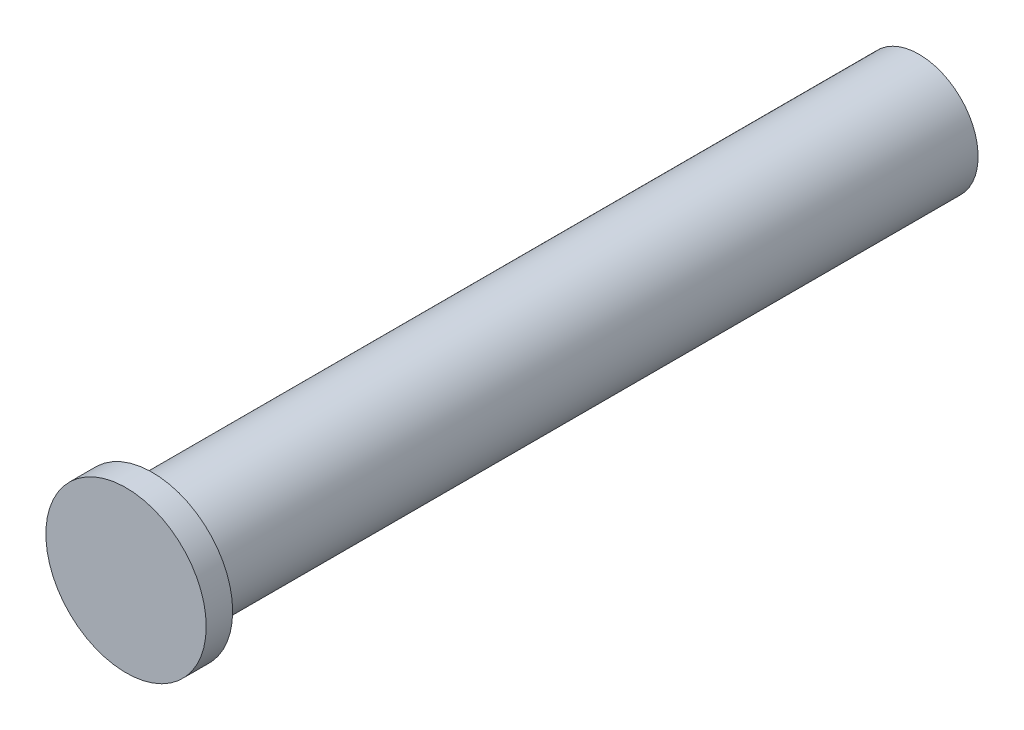
ISO-10303-21;
HEADER;
FILE_DESCRIPTION(('STEP AP214'),'2;1');
FILE_NAME('part.step','',(''),(''),'','','');
FILE_SCHEMA(('AUTOMOTIVE_DESIGN { 1 0 10303 214 1 1 1 1 }'));
ENDSEC;
DATA;
#1=APPLICATION_CONTEXT('core data for automotive mechanical design processes');
#2=APPLICATION_PROTOCOL_DEFINITION('international standard','automotive_design',2000,#1);
#3=PRODUCT_CONTEXT('',#1,'mechanical');
#4=PRODUCT('Part','Part','',(#3));
#5=PRODUCT_RELATED_PRODUCT_CATEGORY('part','',(#4));
#6=PRODUCT_DEFINITION_FORMATION('','',#4);
#7=PRODUCT_DEFINITION_CONTEXT('part definition',#1,'design');
#8=PRODUCT_DEFINITION('design','',#6,#7);
#9=PRODUCT_DEFINITION_SHAPE('','',#8);
#10=(LENGTH_UNIT() NAMED_UNIT(*) SI_UNIT(.MILLI.,.METRE.));
#11=(NAMED_UNIT(*) PLANE_ANGLE_UNIT() SI_UNIT($,.RADIAN.));
#12=(NAMED_UNIT(*) SI_UNIT($,.STERADIAN.) SOLID_ANGLE_UNIT());
#13=UNCERTAINTY_MEASURE_WITH_UNIT(LENGTH_MEASURE(1.E-05),#10,'distance_accuracy_value','');
#14=(GEOMETRIC_REPRESENTATION_CONTEXT(3) GLOBAL_UNCERTAINTY_ASSIGNED_CONTEXT((#13)) GLOBAL_UNIT_ASSIGNED_CONTEXT((#10,
#11,#12)) REPRESENTATION_CONTEXT('',''));
#15=CARTESIAN_POINT('',(0.,0.,0.));
#16=DIRECTION('',(0.,0.,1.));
#17=DIRECTION('',(1.,0.,0.));
#18=AXIS2_PLACEMENT_3D('',#15,#16,#17);
#19=CARTESIAN_POINT('',(0.,0.,-3.));
#20=DIRECTION('',(0.,0.,1.));
#21=DIRECTION('',(1.,0.,0.));
#22=AXIS2_PLACEMENT_3D('',#19,#20,#21);
#23=CYLINDRICAL_SURFACE('',#22,9.1);
#24=CARTESIAN_POINT('',(0.,0.,-3.));
#25=DIRECTION('',(0.,0.,1.));
#26=DIRECTION('',(1.,0.,0.));
#27=AXIS2_PLACEMENT_3D('',#24,#25,#26);
#28=CIRCLE('',#27,9.1);
#29=CARTESIAN_POINT('',(9.1,0.,-3.));
#30=VERTEX_POINT('',#29);
#31=EDGE_CURVE('E48',#30,#30,#28,.T.);
#32=ORIENTED_EDGE('',*,*,#31,.T.);
#33=EDGE_LOOP('',(#32));
#34=FACE_BOUND('',#33,.T.);
#35=CARTESIAN_POINT('',(0.,0.,0.));
#36=DIRECTION('',(0.,0.,1.));
#37=DIRECTION('',(1.,0.,0.));
#38=AXIS2_PLACEMENT_3D('',#35,#36,#37);
#39=CIRCLE('',#38,9.1);
#40=CARTESIAN_POINT('',(9.1,0.,0.));
#41=VERTEX_POINT('',#40);
#42=EDGE_CURVE('E44',#41,#41,#39,.T.);
#43=ORIENTED_EDGE('',*,*,#42,.F.);
#44=EDGE_LOOP('',(#43));
#45=FACE_BOUND('',#44,.T.);
#46=ADVANCED_FACE('F41',(#34,#45),#23,.T.);
#47=CARTESIAN_POINT('',(0.,0.,-3.));
#48=DIRECTION('',(0.,0.,1.));
#49=DIRECTION('',(1.,0.,0.));
#50=AXIS2_PLACEMENT_3D('',#47,#48,#49);
#51=PLANE('',#50);
#52=CARTESIAN_POINT('',(0.,0.,-3.));
#53=DIRECTION('',(0.,0.,-1.));
#54=DIRECTION('',(-1.,0.,0.));
#55=AXIS2_PLACEMENT_3D('',#52,#53,#54);
#56=CIRCLE('',#55,6.7);
#57=CARTESIAN_POINT('',(-6.7,0.,-3.));
#58=VERTEX_POINT('',#57);
#59=EDGE_CURVE('E11',#58,#58,#56,.T.);
#60=ORIENTED_EDGE('',*,*,#59,.F.);
#61=EDGE_LOOP('',(#60));
#62=FACE_BOUND('',#61,.T.);
#63=ORIENTED_EDGE('',*,*,#31,.F.);
#64=EDGE_LOOP('',(#63));
#65=FACE_BOUND('',#64,.T.);
#66=ADVANCED_FACE('F78',(#62,#65),#51,.F.);
#67=CARTESIAN_POINT('',(0.,0.,0.));
#68=DIRECTION('',(0.,0.,1.));
#69=DIRECTION('',(1.,0.,0.));
#70=AXIS2_PLACEMENT_3D('',#67,#68,#69);
#71=PLANE('',#70);
#72=ORIENTED_EDGE('',*,*,#42,.T.);
#73=EDGE_LOOP('',(#72));
#74=FACE_BOUND('',#73,.T.);
#75=ADVANCED_FACE('F75',(#74),#71,.T.);
#76=CARTESIAN_POINT('',(0.,0.,-90.));
#77=DIRECTION('',(0.,0.,1.));
#78=DIRECTION('',(1.,0.,0.));
#79=AXIS2_PLACEMENT_3D('',#76,#77,#78);
#80=CYLINDRICAL_SURFACE('',#79,6.7);
#81=CARTESIAN_POINT('',(0.,0.,-90.));
#82=DIRECTION('',(0.,0.,-1.));
#83=DIRECTION('',(-1.,0.,0.));
#84=AXIS2_PLACEMENT_3D('',#81,#82,#83);
#85=CIRCLE('',#84,6.7);
#86=CARTESIAN_POINT('',(-6.7,0.,-90.));
#87=VERTEX_POINT('',#86);
#88=EDGE_CURVE('E62',#87,#87,#85,.T.);
#89=ORIENTED_EDGE('',*,*,#88,.F.);
#90=EDGE_LOOP('',(#89));
#91=FACE_BOUND('',#90,.T.);
#92=ORIENTED_EDGE('',*,*,#59,.T.);
#93=EDGE_LOOP('',(#92));
#94=FACE_BOUND('',#93,.T.);
#95=ADVANCED_FACE('F87',(#91,#94),#80,.T.);
#96=CARTESIAN_POINT('',(0.,0.,-90.));
#97=DIRECTION('',(0.,0.,-1.));
#98=DIRECTION('',(-1.,0.,0.));
#99=AXIS2_PLACEMENT_3D('',#96,#97,#98);
#100=PLANE('',#99);
#101=CARTESIAN_POINT('',(0.,0.,-90.));
#102=DIRECTION('',(0.,0.,-1.));
#103=DIRECTION('',(-1.,0.,0.));
#104=AXIS2_PLACEMENT_3D('',#101,#102,#103);
#105=CIRCLE('',#104,2.09999999999999);
#106=CARTESIAN_POINT('',(-2.09999999999999,0.,-90.));
#107=VERTEX_POINT('',#106);
#108=EDGE_CURVE('E63',#107,#107,#105,.T.);
#109=ORIENTED_EDGE('',*,*,#108,.F.);
#110=EDGE_LOOP('',(#109));
#111=FACE_BOUND('',#110,.T.);
#112=ORIENTED_EDGE('',*,*,#88,.T.);
#113=EDGE_LOOP('',(#112));
#114=FACE_BOUND('',#113,.T.);
#115=ADVANCED_FACE('F56',(#111,#114),#100,.T.);
#116=CARTESIAN_POINT('',(0.,0.,-68.));
#117=DIRECTION('',(0.,0.,-1.));
#118=DIRECTION('',(-1.,0.,0.));
#119=AXIS2_PLACEMENT_3D('',#116,#117,#118);
#120=CONICAL_SURFACE('',#119,2.09999999999999,1.02974425867665);
#121=CARTESIAN_POINT('',(0.,0.,-66.7381927000421));
#122=VERTEX_POINT('',#121);
#123=VERTEX_LOOP('',#122);
#124=FACE_BOUND('',#123,.T.);
#125=CARTESIAN_POINT('',(0.,0.,-68.));
#126=DIRECTION('',(0.,0.,-1.));
#127=DIRECTION('',(-1.,0.,0.));
#128=AXIS2_PLACEMENT_3D('',#125,#126,#127);
#129=CIRCLE('',#128,2.09999999999999);
#130=CARTESIAN_POINT('',(-2.09999999999999,0.,-68.));
#131=VERTEX_POINT('',#130);
#132=EDGE_CURVE('E60',#131,#131,#129,.T.);
#133=ORIENTED_EDGE('',*,*,#132,.T.);
#134=EDGE_LOOP('',(#133));
#135=FACE_BOUND('',#134,.T.);
#136=ADVANCED_FACE('F52',(#124,#135),#120,.F.);
#137=CARTESIAN_POINT('',(0.,0.,-90.));
#138=DIRECTION('',(0.,0.,-1.));
#139=DIRECTION('',(-1.,0.,0.));
#140=AXIS2_PLACEMENT_3D('',#137,#138,#139);
#141=CYLINDRICAL_SURFACE('',#140,2.09999999999999);
#142=ORIENTED_EDGE('',*,*,#132,.F.);
#143=EDGE_LOOP('',(#142));
#144=FACE_BOUND('',#143,.T.);
#145=ORIENTED_EDGE('',*,*,#108,.T.);
#146=EDGE_LOOP('',(#145));
#147=FACE_BOUND('',#146,.T.);
#148=ADVANCED_FACE('F55',(#144,#147),#141,.F.);
#149=CLOSED_SHELL('',(#46,#66,#75,#95,#115,#136,#148));
#150=MANIFOLD_SOLID_BREP('B2',#149);
#151=ADVANCED_BREP_SHAPE_REPRESENTATION('',(#18,#150),#14);
#152=SHAPE_DEFINITION_REPRESENTATION(#9,#151);
ENDSEC;
END-ISO-10303-21;
